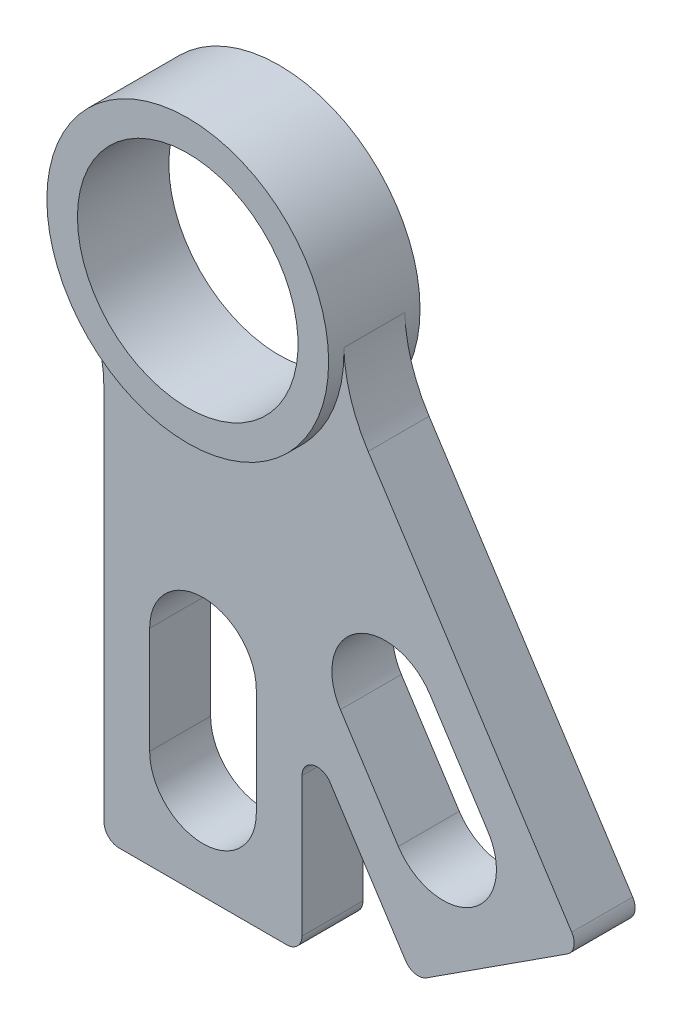
ISO-10303-21;
HEADER;
FILE_DESCRIPTION(('STEP AP214'),'2;1');
FILE_NAME('part.step','',(''),(''),'','','');
FILE_SCHEMA(('AUTOMOTIVE_DESIGN { 1 0 10303 214 1 1 1 1 }'));
ENDSEC;
DATA;
#1=APPLICATION_CONTEXT('core data for automotive mechanical design processes');
#2=APPLICATION_PROTOCOL_DEFINITION('international standard','automotive_design',2000,#1);
#3=PRODUCT_CONTEXT('',#1,'mechanical');
#4=PRODUCT('Part','Part','',(#3));
#5=PRODUCT_RELATED_PRODUCT_CATEGORY('part','',(#4));
#6=PRODUCT_DEFINITION_FORMATION('','',#4);
#7=PRODUCT_DEFINITION_CONTEXT('part definition',#1,'design');
#8=PRODUCT_DEFINITION('design','',#6,#7);
#9=PRODUCT_DEFINITION_SHAPE('','',#8);
#10=(LENGTH_UNIT() NAMED_UNIT(*) SI_UNIT(.MILLI.,.METRE.));
#11=(NAMED_UNIT(*) PLANE_ANGLE_UNIT() SI_UNIT($,.RADIAN.));
#12=(NAMED_UNIT(*) SI_UNIT($,.STERADIAN.) SOLID_ANGLE_UNIT());
#13=UNCERTAINTY_MEASURE_WITH_UNIT(LENGTH_MEASURE(1.E-05),#10,'distance_accuracy_value','');
#14=(GEOMETRIC_REPRESENTATION_CONTEXT(3) GLOBAL_UNCERTAINTY_ASSIGNED_CONTEXT((#13)) GLOBAL_UNIT_ASSIGNED_CONTEXT((#10,
#11,#12)) REPRESENTATION_CONTEXT('',''));
#15=CARTESIAN_POINT('',(0.,0.,0.));
#16=DIRECTION('',(0.,0.,1.));
#17=DIRECTION('',(1.,0.,0.));
#18=AXIS2_PLACEMENT_3D('',#15,#16,#17);
#19=CARTESIAN_POINT('',(0.,0.,4.7625));
#20=DIRECTION('',(0.,0.,-1.));
#21=DIRECTION('',(-1.,0.,0.));
#22=AXIS2_PLACEMENT_3D('',#19,#20,#21);
#23=CYLINDRICAL_SURFACE('',#22,11.495405);
#24=CARTESIAN_POINT('',(0.,0.,4.7625));
#25=DIRECTION('',(0.,0.,1.));
#26=DIRECTION('',(1.,0.,0.));
#27=AXIS2_PLACEMENT_3D('',#24,#25,#26);
#28=CIRCLE('',#27,11.495405);
#29=CARTESIAN_POINT('',(-11.495405,0.,4.7625));
#30=VERTEX_POINT('',#29);
#31=EDGE_CURVE('E384',#30,#30,#28,.T.);
#32=CARTESIAN_POINT('',(0.,0.,-4.7625));
#33=DIRECTION('',(0.,0.,1.));
#34=DIRECTION('',(1.,0.,0.));
#35=AXIS2_PLACEMENT_3D('',#32,#33,#34);
#36=CIRCLE('',#35,11.495405);
#37=CARTESIAN_POINT('',(-11.495405,0.,-4.7625));
#38=VERTEX_POINT('',#37);
#39=EDGE_CURVE('E365',#38,#38,#36,.T.);
#40=CARTESIAN_POINT('',(-11.495405,0.,4.7625));
#41=CARTESIAN_POINT('',(-11.495405,0.,4.66328125));
#42=CARTESIAN_POINT('',(-11.495405,0.,4.5640625));
#43=CARTESIAN_POINT('',(-11.495405,0.,4.365625));
#44=CARTESIAN_POINT('',(-11.495405,0.,4.26640625));
#45=CARTESIAN_POINT('',(-11.495405,0.,4.06796875));
#46=CARTESIAN_POINT('',(-11.495405,0.,3.96875));
#47=CARTESIAN_POINT('',(-11.495405,0.,3.7703125));
#48=CARTESIAN_POINT('',(-11.495405,0.,3.67109375));
#49=CARTESIAN_POINT('',(-11.495405,0.,3.47265625));
#50=CARTESIAN_POINT('',(-11.495405,0.,3.3734375));
#51=CARTESIAN_POINT('',(-11.495405,0.,3.175));
#52=CARTESIAN_POINT('',(-11.495405,0.,3.07578125));
#53=CARTESIAN_POINT('',(-11.495405,0.,2.87734375));
#54=CARTESIAN_POINT('',(-11.495405,0.,2.778125));
#55=CARTESIAN_POINT('',(-11.495405,0.,2.5796875));
#56=CARTESIAN_POINT('',(-11.495405,0.,2.48046875));
#57=CARTESIAN_POINT('',(-11.495405,0.,2.28203125));
#58=CARTESIAN_POINT('',(-11.495405,0.,2.1828125));
#59=CARTESIAN_POINT('',(-11.495405,0.,1.984375));
#60=CARTESIAN_POINT('',(-11.495405,0.,1.88515625));
#61=CARTESIAN_POINT('',(-11.495405,0.,1.68671875));
#62=CARTESIAN_POINT('',(-11.495405,0.,1.5875));
#63=CARTESIAN_POINT('',(-11.495405,0.,1.3890625));
#64=CARTESIAN_POINT('',(-11.495405,0.,1.28984375));
#65=CARTESIAN_POINT('',(-11.495405,0.,1.09140625));
#66=CARTESIAN_POINT('',(-11.495405,0.,0.992187499999999));
#67=CARTESIAN_POINT('',(-11.495405,0.,0.79375));
#68=CARTESIAN_POINT('',(-11.495405,0.,0.69453125));
#69=CARTESIAN_POINT('',(-11.495405,0.,0.49609375));
#70=CARTESIAN_POINT('',(-11.495405,0.,0.396875));
#71=CARTESIAN_POINT('',(-11.495405,0.,0.1984375));
#72=CARTESIAN_POINT('',(-11.495405,0.,0.0992187500000001));
#73=CARTESIAN_POINT('',(-11.495405,0.,-0.0992187500000001));
#74=CARTESIAN_POINT('',(-11.495405,0.,-0.1984375));
#75=CARTESIAN_POINT('',(-11.495405,0.,-0.396875));
#76=CARTESIAN_POINT('',(-11.495405,0.,-0.49609375));
#77=CARTESIAN_POINT('',(-11.495405,0.,-0.69453125));
#78=CARTESIAN_POINT('',(-11.495405,0.,-0.793750000000001));
#79=CARTESIAN_POINT('',(-11.495405,0.,-0.992187500000001));
#80=CARTESIAN_POINT('',(-11.495405,0.,-1.09140625));
#81=CARTESIAN_POINT('',(-11.495405,0.,-1.28984375));
#82=CARTESIAN_POINT('',(-11.495405,0.,-1.3890625));
#83=CARTESIAN_POINT('',(-11.495405,0.,-1.5875));
#84=CARTESIAN_POINT('',(-11.495405,0.,-1.68671875));
#85=CARTESIAN_POINT('',(-11.495405,0.,-1.88515625));
#86=CARTESIAN_POINT('',(-11.495405,0.,-1.984375));
#87=CARTESIAN_POINT('',(-11.495405,0.,-2.1828125));
#88=CARTESIAN_POINT('',(-11.495405,0.,-2.28203125));
#89=CARTESIAN_POINT('',(-11.495405,0.,-2.48046875));
#90=CARTESIAN_POINT('',(-11.495405,0.,-2.5796875));
#91=CARTESIAN_POINT('',(-11.495405,0.,-2.778125));
#92=CARTESIAN_POINT('',(-11.495405,0.,-2.87734375));
#93=CARTESIAN_POINT('',(-11.495405,0.,-3.07578125));
#94=CARTESIAN_POINT('',(-11.495405,0.,-3.175));
#95=CARTESIAN_POINT('',(-11.495405,0.,-3.3734375));
#96=CARTESIAN_POINT('',(-11.495405,0.,-3.47265625));
#97=CARTESIAN_POINT('',(-11.495405,0.,-3.67109375));
#98=CARTESIAN_POINT('',(-11.495405,0.,-3.7703125));
#99=CARTESIAN_POINT('',(-11.495405,0.,-3.96875));
#100=CARTESIAN_POINT('',(-11.495405,0.,-4.06796875));
#101=CARTESIAN_POINT('',(-11.495405,0.,-4.26640625));
#102=CARTESIAN_POINT('',(-11.495405,0.,-4.365625));
#103=CARTESIAN_POINT('',(-11.495405,0.,-4.5640625));
#104=CARTESIAN_POINT('',(-11.495405,0.,-4.66328125));
#105=CARTESIAN_POINT('',(-11.495405,0.,-4.7625));
#106=B_SPLINE_CURVE_WITH_KNOTS('',3,(#40,#41,#42,#43,#44,#45,#46,#47,#48,#49,#50,#51,#52,#53,
#54,#55,#56,#57,#58,#59,#60,#61,#62,#63,#64,#65,#66,#67,#68,#69,#70,#71,#72,#73,#74,#75,#76,#77,
#78,#79,#80,#81,#82,#83,#84,#85,#86,#87,#88,#89,#90,#91,#92,#93,#94,#95,#96,#97,#98,#99,#100,
#101,#102,#103,#104,#105),.UNSPECIFIED.,.F.,.F.,(4,2,2,2,2,2,2,2,2,2,2,2,2,2,2,2,2,2,2,2,2,2,2,
2,2,2,2,2,2,2,2,2,4),(0.,0.29765625,0.5953125,0.892968750000001,1.190625,1.48828125,1.7859375,
2.08359375,2.38125,2.67890625,2.9765625,3.27421875,3.571875,3.86953125,4.1671875,4.46484375,
4.7625,5.06015625,5.3578125,5.65546875,5.953125,6.25078125,6.5484375,6.84609375,7.14375,
7.44140625,7.7390625,8.03671875,8.334375,8.63203125,8.9296875,9.22734375,9.525),.UNSPECIFIED.);
#107=EDGE_CURVE('BSEAM52',#30,#38,#106,.T.);
#108=ORIENTED_EDGE('',*,*,#31,.T.);
#109=ORIENTED_EDGE('',*,*,#39,.F.);
#110=ORIENTED_EDGE('',*,*,#107,.T.);
#111=ORIENTED_EDGE('',*,*,#107,.F.);
#112=EDGE_LOOP('',(#108,#110,#109,#111));
#113=FACE_BOUND('',#112,.T.);
#114=ADVANCED_FACE('F52',(#113),#23,.F.);
#115=CARTESIAN_POINT('',(0.,0.,4.7625));
#116=DIRECTION('',(0.,0.,-1.));
#117=DIRECTION('',(-1.,0.,0.));
#118=AXIS2_PLACEMENT_3D('',#115,#116,#117);
#119=CYLINDRICAL_SURFACE('',#118,14.6812);
#120=DIRECTION('',(0.,0.,-1.));
#121=VECTOR('',#120,1.);
#122=CARTESIAN_POINT('',(-12.585193266832,-7.55979787272684,3.175));
#123=LINE('',#122,#121);
#124=CARTESIAN_POINT('',(-12.585193266832,-7.55979787272667,3.175));
#125=VERTEX_POINT('',#124);
#126=CARTESIAN_POINT('',(-12.585193266832,-7.55979787272684,-3.175));
#127=VERTEX_POINT('',#126);
#128=EDGE_CURVE('E215',#125,#127,#123,.T.);
#129=ORIENTED_EDGE('',*,*,#128,.F.);
#130=CARTESIAN_POINT('',(0.,0.,3.175));
#131=DIRECTION('',(0.,0.,1.));
#132=DIRECTION('',(1.,0.,0.));
#133=AXIS2_PLACEMENT_3D('',#130,#131,#132);
#134=CIRCLE('',#133,14.6812);
#135=CARTESIAN_POINT('',(14.6729838648988,0.491098707398727,3.175));
#136=VERTEX_POINT('',#135);
#137=EDGE_CURVE('E232',#125,#136,#134,.T.);
#138=ORIENTED_EDGE('',*,*,#137,.T.);
#139=DIRECTION('',(0.,0.,-1.));
#140=VECTOR('',#139,1.);
#141=CARTESIAN_POINT('',(14.6729838648992,0.491098707398739,3.175));
#142=LINE('',#141,#140);
#143=CARTESIAN_POINT('',(14.6729838648992,0.491098707398739,-3.175));
#144=VERTEX_POINT('',#143);
#145=EDGE_CURVE('E289',#136,#144,#142,.T.);
#146=ORIENTED_EDGE('',*,*,#145,.T.);
#147=CARTESIAN_POINT('',(0.,0.,-3.175));
#148=DIRECTION('',(0.,0.,1.));
#149=DIRECTION('',(1.,0.,0.));
#150=AXIS2_PLACEMENT_3D('',#147,#148,#149);
#151=CIRCLE('',#150,14.6812);
#152=EDGE_CURVE('E290',#127,#144,#151,.T.);
#153=ORIENTED_EDGE('',*,*,#152,.F.);
#154=EDGE_LOOP('',(#129,#138,#146,#153));
#155=FACE_BOUND('',#154,.T.);
#156=CARTESIAN_POINT('',(0.,0.,4.7625));
#157=DIRECTION('',(0.,0.,1.));
#158=DIRECTION('',(1.,0.,0.));
#159=AXIS2_PLACEMENT_3D('',#156,#157,#158);
#160=CIRCLE('',#159,14.6812);
#161=CARTESIAN_POINT('',(14.6812,0.,4.7625));
#162=VERTEX_POINT('',#161);
#163=EDGE_CURVE('E388',#162,#162,#160,.T.);
#164=ORIENTED_EDGE('',*,*,#163,.F.);
#165=EDGE_LOOP('',(#164));
#166=FACE_BOUND('',#165,.T.);
#167=CARTESIAN_POINT('',(0.,0.,-4.7625));
#168=DIRECTION('',(0.,0.,1.));
#169=DIRECTION('',(1.,0.,0.));
#170=AXIS2_PLACEMENT_3D('',#167,#168,#169);
#171=CIRCLE('',#170,14.6812);
#172=CARTESIAN_POINT('',(14.6812,0.,-4.7625));
#173=VERTEX_POINT('',#172);
#174=EDGE_CURVE('E389',#173,#173,#171,.T.);
#175=ORIENTED_EDGE('',*,*,#174,.T.);
#176=EDGE_LOOP('',(#175));
#177=FACE_BOUND('',#176,.T.);
#178=ADVANCED_FACE('F492',(#155,#166,#177),#119,.T.);
#179=CARTESIAN_POINT('',(0.,0.,4.7625));
#180=DIRECTION('',(0.,0.,1.));
#181=DIRECTION('',(1.,0.,0.));
#182=AXIS2_PLACEMENT_3D('',#179,#180,#181);
#183=PLANE('',#182);
#184=ORIENTED_EDGE('',*,*,#31,.F.);
#185=EDGE_LOOP('',(#184));
#186=FACE_BOUND('',#185,.T.);
#187=ORIENTED_EDGE('',*,*,#163,.T.);
#188=EDGE_LOOP('',(#187));
#189=FACE_BOUND('',#188,.T.);
#190=ADVANCED_FACE('F519',(#186,#189),#183,.T.);
#191=CARTESIAN_POINT('',(0.,0.,-4.7625));
#192=DIRECTION('',(0.,0.,1.));
#193=DIRECTION('',(1.,0.,0.));
#194=AXIS2_PLACEMENT_3D('',#191,#192,#193);
#195=PLANE('',#194);
#196=ORIENTED_EDGE('',*,*,#39,.T.);
#197=EDGE_LOOP('',(#196));
#198=FACE_BOUND('',#197,.T.);
#199=ORIENTED_EDGE('',*,*,#174,.F.);
#200=EDGE_LOOP('',(#199));
#201=FACE_BOUND('',#200,.T.);
#202=ADVANCED_FACE('F523',(#198,#201),#195,.F.);
#203=CARTESIAN_POINT('',(0.,-34.9430697939256,3.175));
#204=DIRECTION('',(0.,0.,-1.));
#205=DIRECTION('',(-1.,0.,0.));
#206=AXIS2_PLACEMENT_3D('',#203,#204,#205);
#207=CYLINDRICAL_SURFACE('',#206,5.55624999999845);
#208=CARTESIAN_POINT('',(0.,-34.9430697939256,-3.175));
#209=DIRECTION('',(0.,0.,1.));
#210=DIRECTION('',(1.,0.,0.));
#211=AXIS2_PLACEMENT_3D('',#208,#209,#210);
#212=CIRCLE('',#211,5.55624999999845);
#213=CARTESIAN_POINT('',(5.55624999999848,-34.9430697939256,-3.175));
#214=VERTEX_POINT('',#213);
#215=CARTESIAN_POINT('',(-5.55624999999842,-34.9430697939256,-3.175));
#216=VERTEX_POINT('',#215);
#217=EDGE_CURVE('E337',#214,#216,#212,.T.);
#218=ORIENTED_EDGE('',*,*,#217,.F.);
#219=DIRECTION('',(0.,0.,-1.));
#220=VECTOR('',#219,1.);
#221=CARTESIAN_POINT('',(5.55624999999848,-34.9430697939256,3.175));
#222=LINE('',#221,#220);
#223=CARTESIAN_POINT('',(5.55624999999848,-34.9430697939256,3.175));
#224=VERTEX_POINT('',#223);
#225=EDGE_CURVE('E362',#224,#214,#222,.T.);
#226=ORIENTED_EDGE('',*,*,#225,.F.);
#227=CARTESIAN_POINT('',(0.,-34.9430697939256,3.175));
#228=DIRECTION('',(0.,0.,1.));
#229=DIRECTION('',(1.,0.,0.));
#230=AXIS2_PLACEMENT_3D('',#227,#228,#229);
#231=CIRCLE('',#230,5.55624999999845);
#232=CARTESIAN_POINT('',(-5.55624999999842,-34.9430697939256,3.175));
#233=VERTEX_POINT('',#232);
#234=EDGE_CURVE('E274',#224,#233,#231,.T.);
#235=ORIENTED_EDGE('',*,*,#234,.T.);
#236=DIRECTION('',(0.,0.,-1.));
#237=VECTOR('',#236,1.);
#238=CARTESIAN_POINT('',(-5.55624999999842,-34.9430697939256,3.175));
#239=LINE('',#238,#237);
#240=EDGE_CURVE('E352',#233,#216,#239,.T.);
#241=ORIENTED_EDGE('',*,*,#240,.T.);
#242=EDGE_LOOP('',(#218,#226,#235,#241));
#243=FACE_BOUND('',#242,.T.);
#244=ADVANCED_FACE('F526',(#243),#207,.F.);
#245=CARTESIAN_POINT('',(5.55624999999848,0.,3.175));
#246=DIRECTION('',(-1.,0.,0.));
#247=DIRECTION('',(0.,0.,1.));
#248=AXIS2_PLACEMENT_3D('',#245,#246,#247);
#249=PLANE('',#248);
#250=DIRECTION('',(0.,1.,0.));
#251=VECTOR('',#250,1.);
#252=CARTESIAN_POINT('',(5.55624999999848,0.,-3.175));
#253=LINE('',#252,#251);
#254=CARTESIAN_POINT('',(5.55624999999848,-46.0555697939288,-3.175));
#255=VERTEX_POINT('',#254);
#256=EDGE_CURVE('E341',#255,#214,#253,.T.);
#257=ORIENTED_EDGE('',*,*,#256,.F.);
#258=DIRECTION('',(0.,0.,-1.));
#259=VECTOR('',#258,1.);
#260=CARTESIAN_POINT('',(5.55624999999848,-46.0555697939288,3.175));
#261=LINE('',#260,#259);
#262=CARTESIAN_POINT('',(5.55624999999848,-46.0555697939288,3.175));
#263=VERTEX_POINT('',#262);
#264=EDGE_CURVE('E359',#263,#255,#261,.T.);
#265=ORIENTED_EDGE('',*,*,#264,.F.);
#266=DIRECTION('',(0.,1.,0.));
#267=VECTOR('',#266,1.);
#268=CARTESIAN_POINT('',(5.55624999999848,0.,3.175));
#269=LINE('',#268,#267);
#270=EDGE_CURVE('E278',#263,#224,#269,.T.);
#271=ORIENTED_EDGE('',*,*,#270,.T.);
#272=ORIENTED_EDGE('',*,*,#225,.T.);
#273=EDGE_LOOP('',(#257,#265,#271,#272));
#274=FACE_BOUND('',#273,.T.);
#275=ADVANCED_FACE('F567',(#274),#249,.T.);
#276=CARTESIAN_POINT('',(0.,-46.0555697939288,3.175));
#277=DIRECTION('',(0.,0.,-1.));
#278=DIRECTION('',(-1.,0.,0.));
#279=AXIS2_PLACEMENT_3D('',#276,#277,#278);
#280=CYLINDRICAL_SURFACE('',#279,5.55624999999845);
#281=CARTESIAN_POINT('',(0.,-46.0555697939288,-3.175));
#282=DIRECTION('',(0.,0.,1.));
#283=DIRECTION('',(1.,0.,0.));
#284=AXIS2_PLACEMENT_3D('',#281,#282,#283);
#285=CIRCLE('',#284,5.55624999999845);
#286=CARTESIAN_POINT('',(-5.55624999999842,-46.0555697939288,-3.175));
#287=VERTEX_POINT('',#286);
#288=EDGE_CURVE('E345',#287,#255,#285,.T.);
#289=ORIENTED_EDGE('',*,*,#288,.F.);
#290=DIRECTION('',(0.,0.,-1.));
#291=VECTOR('',#290,1.);
#292=CARTESIAN_POINT('',(-5.55624999999842,-46.0555697939288,3.175));
#293=LINE('',#292,#291);
#294=CARTESIAN_POINT('',(-5.55624999999842,-46.0555697939288,3.175));
#295=VERTEX_POINT('',#294);
#296=EDGE_CURVE('E355',#295,#287,#293,.T.);
#297=ORIENTED_EDGE('',*,*,#296,.F.);
#298=CARTESIAN_POINT('',(0.,-46.0555697939288,3.175));
#299=DIRECTION('',(0.,0.,1.));
#300=DIRECTION('',(1.,0.,0.));
#301=AXIS2_PLACEMENT_3D('',#298,#299,#300);
#302=CIRCLE('',#301,5.55624999999845);
#303=EDGE_CURVE('E282',#295,#263,#302,.T.);
#304=ORIENTED_EDGE('',*,*,#303,.T.);
#305=ORIENTED_EDGE('',*,*,#264,.T.);
#306=EDGE_LOOP('',(#289,#297,#304,#305));
#307=FACE_BOUND('',#306,.T.);
#308=ADVANCED_FACE('F554',(#307),#280,.F.);
#309=CARTESIAN_POINT('',(18.9851807063152,-29.3356615772006,3.175));
#310=DIRECTION('',(0.,0.,-1.));
#311=DIRECTION('',(-1.,0.,0.));
#312=AXIS2_PLACEMENT_3D('',#309,#310,#311);
#313=CYLINDRICAL_SURFACE('',#312,5.55625000000096);
#314=CARTESIAN_POINT('',(18.9851807063152,-29.3356615772006,-3.175));
#315=DIRECTION('',(0.,0.,1.));
#316=DIRECTION('',(1.,0.,0.));
#317=AXIS2_PLACEMENT_3D('',#314,#315,#316);
#318=CIRCLE('',#317,5.55625000000096);
#319=CARTESIAN_POINT('',(23.649804352708,-26.3168538158465,-3.175));
#320=VERTEX_POINT('',#319);
#321=CARTESIAN_POINT('',(14.3205570599206,-32.354469338556,-3.175));
#322=VERTEX_POINT('',#321);
#323=EDGE_CURVE('E321',#320,#322,#318,.T.);
#324=ORIENTED_EDGE('',*,*,#323,.F.);
#325=DIRECTION('',(0.,0.,-1.));
#326=VECTOR('',#325,1.);
#327=CARTESIAN_POINT('',(23.649804352708,-26.3168538158465,3.175));
#328=LINE('',#327,#326);
#329=CARTESIAN_POINT('',(23.649804352708,-26.3168538158465,3.175));
#330=VERTEX_POINT('',#329);
#331=EDGE_CURVE('E356',#330,#320,#328,.T.);
#332=ORIENTED_EDGE('',*,*,#331,.F.);
#333=CARTESIAN_POINT('',(18.9851807063152,-29.3356615772006,3.175));
#334=DIRECTION('',(0.,0.,1.));
#335=DIRECTION('',(1.,0.,0.));
#336=AXIS2_PLACEMENT_3D('',#333,#334,#335);
#337=CIRCLE('',#336,5.55625000000096);
#338=CARTESIAN_POINT('',(14.3205570599206,-32.354469338556,3.175));
#339=VERTEX_POINT('',#338);
#340=EDGE_CURVE('E259',#330,#339,#337,.T.);
#341=ORIENTED_EDGE('',*,*,#340,.T.);
#342=DIRECTION('',(0.,0.,-1.));
#343=VECTOR('',#342,1.);
#344=CARTESIAN_POINT('',(14.3205570599206,-32.354469338556,3.175));
#345=LINE('',#344,#343);
#346=EDGE_CURVE('E366',#339,#322,#345,.T.);
#347=ORIENTED_EDGE('',*,*,#346,.T.);
#348=EDGE_LOOP('',(#324,#332,#341,#347));
#349=FACE_BOUND('',#348,.T.);
#350=ADVANCED_FACE('F550',(#349),#313,.F.);
#351=CARTESIAN_POINT('',(4.66462364639314,3.01880776135449,3.175));
#352=DIRECTION('',(-0.839527315436279,-0.543317482358478,0.));
#353=DIRECTION('',(0.543317482358478,-0.839527315436279,0.));
#354=AXIS2_PLACEMENT_3D('',#351,#352,#353);
#355=PLANE('',#354);
#356=DIRECTION('',(-0.543317482358478,0.839527315436279,0.));
#357=VECTOR('',#356,1.);
#358=CARTESIAN_POINT('',(4.66462364639314,3.01880776135449,-3.175));
#359=LINE('',#358,#357);
#360=CARTESIAN_POINT('',(29.6874198754185,-35.6461011086351,-3.175));
#361=VERTEX_POINT('',#360);
#362=EDGE_CURVE('E325',#361,#320,#359,.T.);
#363=ORIENTED_EDGE('',*,*,#362,.F.);
#364=DIRECTION('',(0.,0.,-1.));
#365=VECTOR('',#364,1.);
#366=CARTESIAN_POINT('',(29.6874198754185,-35.6461011086351,3.175));
#367=LINE('',#366,#365);
#368=CARTESIAN_POINT('',(29.6874198754185,-35.6461011086351,3.175));
#369=VERTEX_POINT('',#368);
#370=EDGE_CURVE('E372',#369,#361,#367,.T.);
#371=ORIENTED_EDGE('',*,*,#370,.F.);
#372=DIRECTION('',(-0.543317482358478,0.839527315436279,0.));
#373=VECTOR('',#372,1.);
#374=CARTESIAN_POINT('',(4.66462364639314,3.01880776135449,3.175));
#375=LINE('',#374,#373);
#376=EDGE_CURVE('E263',#369,#330,#375,.T.);
#377=ORIENTED_EDGE('',*,*,#376,.T.);
#378=ORIENTED_EDGE('',*,*,#331,.T.);
#379=EDGE_LOOP('',(#363,#371,#377,#378));
#380=FACE_BOUND('',#379,.T.);
#381=ADVANCED_FACE('F553',(#380),#355,.T.);
#382=CARTESIAN_POINT('',(25.0227962290255,-38.6649088699889,3.175));
#383=DIRECTION('',(0.,0.,-1.));
#384=DIRECTION('',(-1.,0.,0.));
#385=AXIS2_PLACEMENT_3D('',#382,#383,#384);
#386=CYLINDRICAL_SURFACE('',#385,5.5562500000004);
#387=CARTESIAN_POINT('',(25.0227962290255,-38.6649088699889,-3.175));
#388=DIRECTION('',(0.,0.,1.));
#389=DIRECTION('',(1.,0.,0.));
#390=AXIS2_PLACEMENT_3D('',#387,#388,#389);
#391=CIRCLE('',#390,5.5562500000004);
#392=CARTESIAN_POINT('',(20.3581725826322,-41.6837166313441,-3.175));
#393=VERTEX_POINT('',#392);
#394=EDGE_CURVE('E329',#393,#361,#391,.T.);
#395=ORIENTED_EDGE('',*,*,#394,.F.);
#396=DIRECTION('',(0.,0.,-1.));
#397=VECTOR('',#396,1.);
#398=CARTESIAN_POINT('',(20.3581725826322,-41.6837166313441,3.175));
#399=LINE('',#398,#397);
#400=CARTESIAN_POINT('',(20.3581725826322,-41.6837166313441,3.175));
#401=VERTEX_POINT('',#400);
#402=EDGE_CURVE('E369',#401,#393,#399,.T.);
#403=ORIENTED_EDGE('',*,*,#402,.F.);
#404=CARTESIAN_POINT('',(25.0227962290255,-38.6649088699889,3.175));
#405=DIRECTION('',(0.,0.,1.));
#406=DIRECTION('',(1.,0.,0.));
#407=AXIS2_PLACEMENT_3D('',#404,#405,#406);
#408=CIRCLE('',#407,5.5562500000004);
#409=EDGE_CURVE('E267',#401,#369,#408,.T.);
#410=ORIENTED_EDGE('',*,*,#409,.T.);
#411=ORIENTED_EDGE('',*,*,#370,.T.);
#412=EDGE_LOOP('',(#395,#403,#410,#411));
#413=FACE_BOUND('',#412,.T.);
#414=ADVANCED_FACE('F533',(#413),#386,.F.);
#415=CARTESIAN_POINT('',(-26.1937499999969,-15.7343197939269,3.175));
#416=DIRECTION('',(0.,0.,-1.));
#417=DIRECTION('',(-1.,0.,0.));
#418=AXIS2_PLACEMENT_3D('',#415,#416,#417);
#419=CYLINDRICAL_SURFACE('',#418,15.8749999999984);
#420=CARTESIAN_POINT('',(-26.1937499999969,-15.7343197939269,-3.175));
#421=DIRECTION('',(0.,0.,1.));
#422=DIRECTION('',(1.,0.,0.));
#423=AXIS2_PLACEMENT_3D('',#420,#421,#422);
#424=CIRCLE('',#423,15.8749999999984);
#425=CARTESIAN_POINT('',(-10.3187499999984,-15.7343197939272,-3.175));
#426=VERTEX_POINT('',#425);
#427=EDGE_CURVE('E210',#426,#127,#424,.T.);
#428=ORIENTED_EDGE('',*,*,#427,.F.);
#429=DIRECTION('',(0.,0.,-1.));
#430=VECTOR('',#429,1.);
#431=CARTESIAN_POINT('',(-10.3187499999984,-15.7343197939272,3.175));
#432=LINE('',#431,#430);
#433=CARTESIAN_POINT('',(-10.3187499999984,-15.7343197939272,3.175));
#434=VERTEX_POINT('',#433);
#435=EDGE_CURVE('E203',#434,#426,#432,.T.);
#436=ORIENTED_EDGE('',*,*,#435,.F.);
#437=CARTESIAN_POINT('',(-26.1937499999969,-15.7343197939269,3.175));
#438=DIRECTION('',(0.,0.,1.));
#439=DIRECTION('',(1.,0.,0.));
#440=AXIS2_PLACEMENT_3D('',#437,#438,#439);
#441=CIRCLE('',#440,15.8749999999984);
#442=EDGE_CURVE('E208',#434,#125,#441,.T.);
#443=ORIENTED_EDGE('',*,*,#442,.T.);
#444=ORIENTED_EDGE('',*,*,#128,.T.);
#445=EDGE_LOOP('',(#428,#436,#443,#444));
#446=FACE_BOUND('',#445,.T.);
#447=ADVANCED_FACE('F205',(#446),#419,.F.);
#448=CARTESIAN_POINT('',(-10.3187499999984,0.,3.175));
#449=DIRECTION('',(1.,0.,0.));
#450=DIRECTION('',(0.,1.,0.));
#451=AXIS2_PLACEMENT_3D('',#448,#449,#450);
#452=PLANE('',#451);
#453=DIRECTION('',(0.,-1.,0.));
#454=VECTOR('',#453,1.);
#455=CARTESIAN_POINT('',(-10.3187499999984,0.,-3.175));
#456=LINE('',#455,#454);
#457=CARTESIAN_POINT('',(-10.3187499999984,-54.7868197939272,-3.175));
#458=VERTEX_POINT('',#457);
#459=EDGE_CURVE('E296',#426,#458,#456,.T.);
#460=ORIENTED_EDGE('',*,*,#459,.T.);
#461=DIRECTION('',(0.,0.,-1.));
#462=VECTOR('',#461,1.);
#463=CARTESIAN_POINT('',(-10.3187499999984,-54.7868197939272,3.175));
#464=LINE('',#463,#462);
#465=CARTESIAN_POINT('',(-10.3187499999984,-54.7868197939272,3.175));
#466=VERTEX_POINT('',#465);
#467=EDGE_CURVE('E222',#458,#466,#464,.F.);
#468=ORIENTED_EDGE('',*,*,#467,.T.);
#469=DIRECTION('',(0.,-1.,0.));
#470=VECTOR('',#469,1.);
#471=CARTESIAN_POINT('',(-10.3187499999984,0.,3.175));
#472=LINE('',#471,#470);
#473=EDGE_CURVE('E219',#434,#466,#472,.T.);
#474=ORIENTED_EDGE('',*,*,#473,.F.);
#475=ORIENTED_EDGE('',*,*,#435,.T.);
#476=EDGE_LOOP('',(#460,#468,#474,#475));
#477=FACE_BOUND('',#476,.T.);
#478=ADVANCED_FACE('F220',(#477),#452,.F.);
#479=CARTESIAN_POINT('',(0.,-56.3743197939272,3.175));
#480=DIRECTION('',(0.,1.,0.));
#481=DIRECTION('',(-1.,0.,0.));
#482=AXIS2_PLACEMENT_3D('',#479,#480,#481);
#483=PLANE('',#482);
#484=DIRECTION('',(1.,0.,0.));
#485=VECTOR('',#484,1.);
#486=CARTESIAN_POINT('',(0.,-56.3743197939272,-3.175));
#487=LINE('',#486,#485);
#488=CARTESIAN_POINT('',(-8.73124999999841,-56.3743197939272,-3.175));
#489=VERTEX_POINT('',#488);
#490=CARTESIAN_POINT('',(8.7312499999983,-56.3743197939272,-3.175));
#491=VERTEX_POINT('',#490);
#492=EDGE_CURVE('E299',#489,#491,#487,.T.);
#493=ORIENTED_EDGE('',*,*,#492,.T.);
#494=DIRECTION('',(0.,0.,-1.));
#495=VECTOR('',#494,1.);
#496=CARTESIAN_POINT('',(8.7312499999983,-56.3743197939272,3.175));
#497=LINE('',#496,#495);
#498=CARTESIAN_POINT('',(8.7312499999983,-56.3743197939272,3.175));
#499=VERTEX_POINT('',#498);
#500=EDGE_CURVE('E422',#491,#499,#497,.F.);
#501=ORIENTED_EDGE('',*,*,#500,.T.);
#502=DIRECTION('',(1.,0.,0.));
#503=VECTOR('',#502,1.);
#504=CARTESIAN_POINT('',(0.,-56.3743197939272,3.175));
#505=LINE('',#504,#503);
#506=CARTESIAN_POINT('',(-8.73124999999841,-56.3743197939272,3.175));
#507=VERTEX_POINT('',#506);
#508=EDGE_CURVE('E225',#507,#499,#505,.T.);
#509=ORIENTED_EDGE('',*,*,#508,.F.);
#510=DIRECTION('',(0.,0.,-1.));
#511=VECTOR('',#510,1.);
#512=CARTESIAN_POINT('',(-8.73124999999841,-56.3743197939272,3.175));
#513=LINE('',#512,#511);
#514=EDGE_CURVE('E418',#507,#489,#513,.T.);
#515=ORIENTED_EDGE('',*,*,#514,.T.);
#516=EDGE_LOOP('',(#493,#501,#509,#515));
#517=FACE_BOUND('',#516,.T.);
#518=ADVANCED_FACE('F501',(#517),#483,.F.);
#519=CARTESIAN_POINT('',(10.318749999996,4.29180784705601E-13,3.175));
#520=DIRECTION('',(1.,0.,0.));
#521=DIRECTION('',(0.,1.,0.));
#522=AXIS2_PLACEMENT_3D('',#519,#520,#521);
#523=PLANE('',#522);
#524=DIRECTION('',(0.,-1.,0.));
#525=VECTOR('',#524,1.);
#526=CARTESIAN_POINT('',(10.318749999996,4.29180784705601E-13,3.175));
#527=LINE('',#526,#525);
#528=CARTESIAN_POINT('',(10.3187499999977,-40.3113700747042,3.175));
#529=VERTEX_POINT('',#528);
#530=CARTESIAN_POINT('',(10.3187499999983,-54.7868197939271,3.175));
#531=VERTEX_POINT('',#530);
#532=EDGE_CURVE('E242',#529,#531,#527,.T.);
#533=ORIENTED_EDGE('',*,*,#532,.T.);
#534=DIRECTION('',(0.,0.,-1.));
#535=VECTOR('',#534,1.);
#536=CARTESIAN_POINT('',(10.3187499999983,-54.7868197939271,-3.175));
#537=LINE('',#536,#535);
#538=CARTESIAN_POINT('',(10.3187499999983,-54.7868197939271,-3.175));
#539=VERTEX_POINT('',#538);
#540=EDGE_CURVE('E402',#531,#539,#537,.T.);
#541=ORIENTED_EDGE('',*,*,#540,.T.);
#542=DIRECTION('',(0.,-1.,0.));
#543=VECTOR('',#542,1.);
#544=CARTESIAN_POINT('',(10.318749999996,4.29180784705601E-13,-3.175));
#545=LINE('',#544,#543);
#546=CARTESIAN_POINT('',(10.3187499999977,-40.3113700747042,-3.175));
#547=VERTEX_POINT('',#546);
#548=EDGE_CURVE('E303',#547,#539,#545,.T.);
#549=ORIENTED_EDGE('',*,*,#548,.F.);
#550=DIRECTION('',(0.,0.,-1.));
#551=VECTOR('',#550,1.);
#552=CARTESIAN_POINT('',(10.3187499999977,-40.3113700747042,3.175));
#553=LINE('',#552,#551);
#554=EDGE_CURVE('E393',#547,#529,#553,.F.);
#555=ORIENTED_EDGE('',*,*,#554,.T.);
#556=EDGE_LOOP('',(#533,#541,#549,#555));
#557=FACE_BOUND('',#556,.T.);
#558=ADVANCED_FACE('F465',(#557),#523,.T.);
#559=CARTESIAN_POINT('',(-8.66287248615638,-5.60635727108545,3.175));
#560=DIRECTION('',(-0.839527315436278,-0.543317482358479,0.));
#561=DIRECTION('',(0.54331748235848,-0.839527315436278,0.));
#562=AXIS2_PLACEMENT_3D('',#559,#560,#561);
#563=PLANE('',#562);
#564=DIRECTION('',(-0.543317482358479,0.839527315436278,0.));
#565=VECTOR('',#564,1.);
#566=CARTESIAN_POINT('',(-8.66287248615638,-5.60635727108545,-3.175));
#567=LINE('',#566,#565);
#568=CARTESIAN_POINT('',(21.1037645107104,-51.6013890139762,-3.175));
#569=VERTEX_POINT('',#568);
#570=CARTESIAN_POINT('',(13.2389996132528,-39.4488535714601,-3.175));
#571=VERTEX_POINT('',#570);
#572=EDGE_CURVE('E307',#569,#571,#567,.T.);
#573=ORIENTED_EDGE('',*,*,#572,.F.);
#574=DIRECTION('',(0.,0.,-1.));
#575=VECTOR('',#574,1.);
#576=CARTESIAN_POINT('',(21.1037645107104,-51.6013890139762,3.175));
#577=LINE('',#576,#575);
#578=CARTESIAN_POINT('',(21.1037645107104,-51.6013890139762,3.175));
#579=VERTEX_POINT('',#578);
#580=EDGE_CURVE('E446',#569,#579,#577,.F.);
#581=ORIENTED_EDGE('',*,*,#580,.T.);
#582=DIRECTION('',(-0.543317482358479,0.839527315436278,0.));
#583=VECTOR('',#582,1.);
#584=CARTESIAN_POINT('',(-8.66287248615638,-5.60635727108545,3.175));
#585=LINE('',#584,#583);
#586=CARTESIAN_POINT('',(13.2389996132528,-39.4488535714601,3.175));
#587=VERTEX_POINT('',#586);
#588=EDGE_CURVE('E246',#579,#587,#585,.T.);
#589=ORIENTED_EDGE('',*,*,#588,.T.);
#590=DIRECTION('',(0.,0.,-1.));
#591=VECTOR('',#590,1.);
#592=CARTESIAN_POINT('',(13.2389996132528,-39.4488535714601,-3.175));
#593=LINE('',#592,#591);
#594=EDGE_CURVE('E442',#587,#571,#593,.T.);
#595=ORIENTED_EDGE('',*,*,#594,.T.);
#596=EDGE_LOOP('',(#573,#581,#589,#595));
#597=FACE_BOUND('',#596,.T.);
#598=ADVANCED_FACE('F473',(#597),#563,.T.);
#599=CARTESIAN_POINT('',(30.6291535001114,-47.3277813561454,3.175));
#600=DIRECTION('',(-0.543317482358489,0.839527315436271,0.));
#601=DIRECTION('',(-0.839527315436271,-0.543317482358489,0.));
#602=AXIS2_PLACEMENT_3D('',#599,#600,#601);
#603=PLANE('',#602);
#604=DIRECTION('',(0.839527315436271,0.543317482358489,0.));
#605=VECTOR('',#604,1.);
#606=CARTESIAN_POINT('',(30.6291535001114,-47.3277813561454,3.175));
#607=LINE('',#606,#605);
#608=CARTESIAN_POINT('',(23.2990306272096,-52.0716221239872,3.175));
#609=VERTEX_POINT('',#608);
#610=CARTESIAN_POINT('',(37.9592763730127,-42.5839405883039,3.175));
#611=VERTEX_POINT('',#610);
#612=EDGE_CURVE('E250',#609,#611,#607,.T.);
#613=ORIENTED_EDGE('',*,*,#612,.F.);
#614=DIRECTION('',(0.,0.,-1.));
#615=VECTOR('',#614,1.);
#616=CARTESIAN_POINT('',(23.2990306272096,-52.0716221239872,-3.175));
#617=LINE('',#616,#615);
#618=CARTESIAN_POINT('',(23.2990306272096,-52.0716221239872,-3.175));
#619=VERTEX_POINT('',#618);
#620=EDGE_CURVE('E438',#609,#619,#617,.T.);
#621=ORIENTED_EDGE('',*,*,#620,.T.);
#622=DIRECTION('',(0.839527315436271,0.543317482358489,0.));
#623=VECTOR('',#622,1.);
#624=CARTESIAN_POINT('',(30.6291535001114,-47.3277813561454,-3.175));
#625=LINE('',#624,#623);
#626=CARTESIAN_POINT('',(37.9592763730127,-42.5839405883039,-3.175));
#627=VERTEX_POINT('',#626);
#628=EDGE_CURVE('E311',#619,#627,#625,.T.);
#629=ORIENTED_EDGE('',*,*,#628,.T.);
#630=DIRECTION('',(0.,0.,-1.));
#631=VECTOR('',#630,1.);
#632=CARTESIAN_POINT('',(37.9592763730127,-42.5839405883039,3.175));
#633=LINE('',#632,#631);
#634=EDGE_CURVE('E76',#627,#611,#633,.F.);
#635=ORIENTED_EDGE('',*,*,#634,.T.);
#636=EDGE_LOOP('',(#613,#621,#629,#635));
#637=FACE_BOUND('',#636,.T.);
#638=ADVANCED_FACE('F478',(#637),#603,.F.);
#639=CARTESIAN_POINT('',(8.66287248615554,5.60635727108527,3.175));
#640=DIRECTION('',(-0.839527315436262,-0.543317482358504,0.));
#641=DIRECTION('',(0.543317482358504,-0.839527315436262,0.));
#642=AXIS2_PLACEMENT_3D('',#639,#640,#641);
#643=PLANE('',#642);
#644=DIRECTION('',(-0.543317482358504,0.839527315436262,0.));
#645=VECTOR('',#644,1.);
#646=CARTESIAN_POINT('',(8.66287248615554,5.60635727108527,3.175));
#647=LINE('',#646,#645);
#648=CARTESIAN_POINT('',(38.4295094830237,-40.3886744718047,3.175));
#649=VERTEX_POINT('',#648);
#650=CARTESIAN_POINT('',(17.2116035032161,-7.60303398572672,3.175));
#651=VERTEX_POINT('',#650);
#652=EDGE_CURVE('E253',#649,#651,#647,.T.);
#653=ORIENTED_EDGE('',*,*,#652,.F.);
#654=DIRECTION('',(0.,0.,-1.));
#655=VECTOR('',#654,1.);
#656=CARTESIAN_POINT('',(38.4295094830237,-40.3886744718047,3.175));
#657=LINE('',#656,#655);
#658=CARTESIAN_POINT('',(38.4295094830237,-40.3886744718047,-3.175));
#659=VERTEX_POINT('',#658);
#660=EDGE_CURVE('E451',#649,#659,#657,.T.);
#661=ORIENTED_EDGE('',*,*,#660,.T.);
#662=DIRECTION('',(-0.543317482358504,0.839527315436262,0.));
#663=VECTOR('',#662,1.);
#664=CARTESIAN_POINT('',(8.66287248615554,5.60635727108527,-3.175));
#665=LINE('',#664,#663);
#666=CARTESIAN_POINT('',(17.2116035032161,-7.60303398572672,-3.175));
#667=VERTEX_POINT('',#666);
#668=EDGE_CURVE('E314',#659,#667,#665,.T.);
#669=ORIENTED_EDGE('',*,*,#668,.T.);
#670=DIRECTION('',(0.,0.,-1.));
#671=VECTOR('',#670,1.);
#672=CARTESIAN_POINT('',(17.2116035032161,-7.60303398572672,3.175));
#673=LINE('',#672,#671);
#674=EDGE_CURVE('E216',#651,#667,#673,.T.);
#675=ORIENTED_EDGE('',*,*,#674,.F.);
#676=EDGE_LOOP('',(#653,#661,#669,#675));
#677=FACE_BOUND('',#676,.T.);
#678=ADVANCED_FACE('F485',(#677),#643,.F.);
#679=CARTESIAN_POINT('',(-4.66462364639679,-3.01880776135752,3.175));
#680=DIRECTION('',(-0.839527315436224,-0.543317482358562,0.));
#681=DIRECTION('',(0.543317482358562,-0.839527315436224,0.));
#682=AXIS2_PLACEMENT_3D('',#679,#680,#681);
#683=PLANE('',#682);
#684=DIRECTION('',(-0.543317482358562,0.839527315436224,0.));
#685=VECTOR('',#684,1.);
#686=CARTESIAN_POINT('',(-4.66462364639679,-3.01880776135752,-3.175));
#687=LINE('',#686,#685);
#688=EDGE_CURVE('E333',#393,#322,#687,.T.);
#689=ORIENTED_EDGE('',*,*,#688,.T.);
#690=ORIENTED_EDGE('',*,*,#346,.F.);
#691=DIRECTION('',(-0.543317482358562,0.839527315436224,0.));
#692=VECTOR('',#691,1.);
#693=CARTESIAN_POINT('',(-4.66462364639679,-3.01880776135752,3.175));
#694=LINE('',#693,#692);
#695=EDGE_CURVE('E271',#401,#339,#694,.T.);
#696=ORIENTED_EDGE('',*,*,#695,.F.);
#697=ORIENTED_EDGE('',*,*,#402,.T.);
#698=EDGE_LOOP('',(#689,#690,#696,#697));
#699=FACE_BOUND('',#698,.T.);
#700=ADVANCED_FACE('F546',(#699),#683,.F.);
#701=CARTESIAN_POINT('',(30.539099635766,1.02213104671393,3.175));
#702=DIRECTION('',(0.,0.,-1.));
#703=DIRECTION('',(-1.,0.,0.));
#704=AXIS2_PLACEMENT_3D('',#701,#702,#703);
#705=CYLINDRICAL_SURFACE('',#704,15.8749999999988);
#706=CARTESIAN_POINT('',(30.539099635766,1.02213104671393,-3.175));
#707=DIRECTION('',(0.,0.,1.));
#708=DIRECTION('',(1.,0.,0.));
#709=AXIS2_PLACEMENT_3D('',#706,#707,#708);
#710=CIRCLE('',#709,15.8749999999988);
#711=EDGE_CURVE('E317',#667,#144,#710,.F.);
#712=ORIENTED_EDGE('',*,*,#711,.T.);
#713=ORIENTED_EDGE('',*,*,#145,.F.);
#714=CARTESIAN_POINT('',(30.539099635766,1.02213104671393,3.175));
#715=DIRECTION('',(0.,0.,1.));
#716=DIRECTION('',(1.,0.,0.));
#717=AXIS2_PLACEMENT_3D('',#714,#715,#716);
#718=CIRCLE('',#717,15.8749999999988);
#719=EDGE_CURVE('E256',#651,#136,#718,.F.);
#720=ORIENTED_EDGE('',*,*,#719,.F.);
#721=ORIENTED_EDGE('',*,*,#674,.T.);
#722=EDGE_LOOP('',(#712,#713,#720,#721));
#723=FACE_BOUND('',#722,.T.);
#724=ADVANCED_FACE('F490',(#723),#705,.F.);
#725=CARTESIAN_POINT('',(-5.55624999999842,0.,3.175));
#726=DIRECTION('',(-1.,0.,0.));
#727=DIRECTION('',(0.,0.,1.));
#728=AXIS2_PLACEMENT_3D('',#725,#726,#727);
#729=PLANE('',#728);
#730=DIRECTION('',(0.,1.,0.));
#731=VECTOR('',#730,1.);
#732=CARTESIAN_POINT('',(-5.55624999999842,0.,-3.175));
#733=LINE('',#732,#731);
#734=EDGE_CURVE('E237',#287,#216,#733,.T.);
#735=ORIENTED_EDGE('',*,*,#734,.T.);
#736=ORIENTED_EDGE('',*,*,#240,.F.);
#737=DIRECTION('',(0.,1.,0.));
#738=VECTOR('',#737,1.);
#739=CARTESIAN_POINT('',(-5.55624999999842,0.,3.175));
#740=LINE('',#739,#738);
#741=EDGE_CURVE('E286',#295,#233,#740,.T.);
#742=ORIENTED_EDGE('',*,*,#741,.F.);
#743=ORIENTED_EDGE('',*,*,#296,.T.);
#744=EDGE_LOOP('',(#735,#736,#742,#743));
#745=FACE_BOUND('',#744,.T.);
#746=ADVANCED_FACE('F549',(#745),#729,.F.);
#747=CARTESIAN_POINT('',(0.,0.,3.175));
#748=DIRECTION('',(0.,0.,1.));
#749=DIRECTION('',(1.,0.,0.));
#750=AXIS2_PLACEMENT_3D('',#747,#748,#749);
#751=PLANE('',#750);
#752=ORIENTED_EDGE('',*,*,#508,.T.);
#753=CARTESIAN_POINT('',(8.7312499999983,-54.7868197939272,3.175));
#754=DIRECTION('',(0.,0.,1.));
#755=DIRECTION('',(1.,0.,0.));
#756=AXIS2_PLACEMENT_3D('',#753,#754,#755);
#757=CIRCLE('',#756,1.5875);
#758=EDGE_CURVE('E433',#499,#531,#757,.T.);
#759=ORIENTED_EDGE('',*,*,#758,.T.);
#760=ORIENTED_EDGE('',*,*,#532,.F.);
#761=CARTESIAN_POINT('',(11.9062499999977,-40.3113700747042,3.175));
#762=DIRECTION('',(0.,0.,1.));
#763=DIRECTION('',(1.,0.,0.));
#764=AXIS2_PLACEMENT_3D('',#761,#762,#763);
#765=CIRCLE('',#764,1.5875);
#766=EDGE_CURVE('E13',#529,#587,#765,.F.);
#767=ORIENTED_EDGE('',*,*,#766,.T.);
#768=ORIENTED_EDGE('',*,*,#588,.F.);
#769=CARTESIAN_POINT('',(22.4365141239655,-50.7388725107321,3.175));
#770=DIRECTION('',(0.,0.,1.));
#771=DIRECTION('',(1.,0.,0.));
#772=AXIS2_PLACEMENT_3D('',#769,#770,#771);
#773=CIRCLE('',#772,1.5875);
#774=EDGE_CURVE('E430',#579,#609,#773,.T.);
#775=ORIENTED_EDGE('',*,*,#774,.T.);
#776=ORIENTED_EDGE('',*,*,#612,.T.);
#777=CARTESIAN_POINT('',(37.0967598697686,-41.2511909750488,3.175));
#778=DIRECTION('',(0.,0.,1.));
#779=DIRECTION('',(1.,0.,0.));
#780=AXIS2_PLACEMENT_3D('',#777,#778,#779);
#781=CIRCLE('',#780,1.5875);
#782=EDGE_CURVE('E68',#611,#649,#781,.T.);
#783=ORIENTED_EDGE('',*,*,#782,.T.);
#784=ORIENTED_EDGE('',*,*,#652,.T.);
#785=ORIENTED_EDGE('',*,*,#719,.T.);
#786=ORIENTED_EDGE('',*,*,#137,.F.);
#787=ORIENTED_EDGE('',*,*,#442,.F.);
#788=ORIENTED_EDGE('',*,*,#473,.T.);
#789=CARTESIAN_POINT('',(-8.73124999999841,-54.7868197939272,3.175));
#790=DIRECTION('',(0.,0.,1.));
#791=DIRECTION('',(1.,0.,0.));
#792=AXIS2_PLACEMENT_3D('',#789,#790,#791);
#793=CIRCLE('',#792,1.5875);
#794=EDGE_CURVE('E427',#466,#507,#793,.T.);
#795=ORIENTED_EDGE('',*,*,#794,.T.);
#796=EDGE_LOOP('',(#752,#759,#760,#767,#768,#775,#776,#783,#784,#785,#786,#787,#788,#795));
#797=FACE_BOUND('',#796,.T.);
#798=ORIENTED_EDGE('',*,*,#340,.F.);
#799=ORIENTED_EDGE('',*,*,#376,.F.);
#800=ORIENTED_EDGE('',*,*,#409,.F.);
#801=ORIENTED_EDGE('',*,*,#695,.T.);
#802=EDGE_LOOP('',(#798,#799,#800,#801));
#803=FACE_BOUND('',#802,.T.);
#804=ORIENTED_EDGE('',*,*,#234,.F.);
#805=ORIENTED_EDGE('',*,*,#270,.F.);
#806=ORIENTED_EDGE('',*,*,#303,.F.);
#807=ORIENTED_EDGE('',*,*,#741,.T.);
#808=EDGE_LOOP('',(#804,#805,#806,#807));
#809=FACE_BOUND('',#808,.T.);
#810=ADVANCED_FACE('F229',(#797,#803,#809),#751,.T.);
#811=CARTESIAN_POINT('',(0.,0.,-3.175));
#812=DIRECTION('',(0.,0.,1.));
#813=DIRECTION('',(1.,0.,0.));
#814=AXIS2_PLACEMENT_3D('',#811,#812,#813);
#815=PLANE('',#814);
#816=ORIENTED_EDGE('',*,*,#548,.T.);
#817=CARTESIAN_POINT('',(8.7312499999983,-54.7868197939272,-3.175));
#818=DIRECTION('',(0.,0.,1.));
#819=DIRECTION('',(1.,0.,0.));
#820=AXIS2_PLACEMENT_3D('',#817,#818,#819);
#821=CIRCLE('',#820,1.5875);
#822=EDGE_CURVE('E415',#539,#491,#821,.F.);
#823=ORIENTED_EDGE('',*,*,#822,.T.);
#824=ORIENTED_EDGE('',*,*,#492,.F.);
#825=CARTESIAN_POINT('',(-8.73124999999841,-54.7868197939272,-3.175));
#826=DIRECTION('',(0.,0.,1.));
#827=DIRECTION('',(1.,0.,0.));
#828=AXIS2_PLACEMENT_3D('',#825,#826,#827);
#829=CIRCLE('',#828,1.5875);
#830=EDGE_CURVE('E409',#489,#458,#829,.F.);
#831=ORIENTED_EDGE('',*,*,#830,.T.);
#832=ORIENTED_EDGE('',*,*,#459,.F.);
#833=ORIENTED_EDGE('',*,*,#427,.T.);
#834=ORIENTED_EDGE('',*,*,#152,.T.);
#835=ORIENTED_EDGE('',*,*,#711,.F.);
#836=ORIENTED_EDGE('',*,*,#668,.F.);
#837=CARTESIAN_POINT('',(37.0967598697686,-41.2511909750488,-3.175));
#838=DIRECTION('',(0.,0.,1.));
#839=DIRECTION('',(1.,0.,0.));
#840=AXIS2_PLACEMENT_3D('',#837,#838,#839);
#841=CIRCLE('',#840,1.5875);
#842=EDGE_CURVE('E406',#659,#627,#841,.F.);
#843=ORIENTED_EDGE('',*,*,#842,.T.);
#844=ORIENTED_EDGE('',*,*,#628,.F.);
#845=CARTESIAN_POINT('',(22.4365141239655,-50.7388725107321,-3.175));
#846=DIRECTION('',(0.,0.,1.));
#847=DIRECTION('',(1.,0.,0.));
#848=AXIS2_PLACEMENT_3D('',#845,#846,#847);
#849=CIRCLE('',#848,1.5875);
#850=EDGE_CURVE('E412',#619,#569,#849,.F.);
#851=ORIENTED_EDGE('',*,*,#850,.T.);
#852=ORIENTED_EDGE('',*,*,#572,.T.);
#853=CARTESIAN_POINT('',(11.9062499999977,-40.3113700747042,-3.175));
#854=DIRECTION('',(0.,0.,1.));
#855=DIRECTION('',(1.,0.,0.));
#856=AXIS2_PLACEMENT_3D('',#853,#854,#855);
#857=CIRCLE('',#856,1.5875);
#858=EDGE_CURVE('E61',#571,#547,#857,.T.);
#859=ORIENTED_EDGE('',*,*,#858,.T.);
#860=EDGE_LOOP('',(#816,#823,#824,#831,#832,#833,#834,#835,#836,#843,#844,#851,#852,#859));
#861=FACE_BOUND('',#860,.T.);
#862=ORIENTED_EDGE('',*,*,#323,.T.);
#863=ORIENTED_EDGE('',*,*,#688,.F.);
#864=ORIENTED_EDGE('',*,*,#394,.T.);
#865=ORIENTED_EDGE('',*,*,#362,.T.);
#866=EDGE_LOOP('',(#862,#863,#864,#865));
#867=FACE_BOUND('',#866,.T.);
#868=ORIENTED_EDGE('',*,*,#217,.T.);
#869=ORIENTED_EDGE('',*,*,#734,.F.);
#870=ORIENTED_EDGE('',*,*,#288,.T.);
#871=ORIENTED_EDGE('',*,*,#256,.T.);
#872=EDGE_LOOP('',(#868,#869,#870,#871));
#873=FACE_BOUND('',#872,.T.);
#874=ADVANCED_FACE('F458',(#861,#867,#873),#815,.F.);
#875=CARTESIAN_POINT('',(8.7312499999983,-54.7868197939272,3.175));
#876=DIRECTION('',(0.,0.,1.));
#877=DIRECTION('',(1.,0.,0.));
#878=AXIS2_PLACEMENT_3D('',#875,#876,#877);
#879=CYLINDRICAL_SURFACE('',#878,1.5875);
#880=ORIENTED_EDGE('',*,*,#758,.F.);
#881=ORIENTED_EDGE('',*,*,#500,.F.);
#882=ORIENTED_EDGE('',*,*,#822,.F.);
#883=ORIENTED_EDGE('',*,*,#540,.F.);
#884=EDGE_LOOP('',(#880,#881,#882,#883));
#885=FACE_BOUND('',#884,.T.);
#886=ADVANCED_FACE('F504',(#885),#879,.T.);
#887=CARTESIAN_POINT('',(22.4365141239655,-50.7388725107321,3.175));
#888=DIRECTION('',(0.,0.,1.));
#889=DIRECTION('',(1.,0.,0.));
#890=AXIS2_PLACEMENT_3D('',#887,#888,#889);
#891=CYLINDRICAL_SURFACE('',#890,1.5875);
#892=ORIENTED_EDGE('',*,*,#774,.F.);
#893=ORIENTED_EDGE('',*,*,#580,.F.);
#894=ORIENTED_EDGE('',*,*,#850,.F.);
#895=ORIENTED_EDGE('',*,*,#620,.F.);
#896=EDGE_LOOP('',(#892,#893,#894,#895));
#897=FACE_BOUND('',#896,.T.);
#898=ADVANCED_FACE('F476',(#897),#891,.T.);
#899=CARTESIAN_POINT('',(11.9062499999977,-40.3113700747042,3.175));
#900=DIRECTION('',(0.,0.,1.));
#901=DIRECTION('',(1.,0.,0.));
#902=AXIS2_PLACEMENT_3D('',#899,#900,#901);
#903=CYLINDRICAL_SURFACE('',#902,1.5875);
#904=ORIENTED_EDGE('',*,*,#766,.F.);
#905=ORIENTED_EDGE('',*,*,#554,.F.);
#906=ORIENTED_EDGE('',*,*,#858,.F.);
#907=ORIENTED_EDGE('',*,*,#594,.F.);
#908=EDGE_LOOP('',(#904,#905,#906,#907));
#909=FACE_BOUND('',#908,.T.);
#910=ADVANCED_FACE('F469',(#909),#903,.F.);
#911=CARTESIAN_POINT('',(-8.73124999999841,-54.7868197939272,3.175));
#912=DIRECTION('',(0.,0.,-1.));
#913=DIRECTION('',(-1.,0.,0.));
#914=AXIS2_PLACEMENT_3D('',#911,#912,#913);
#915=CYLINDRICAL_SURFACE('',#914,1.5875);
#916=ORIENTED_EDGE('',*,*,#794,.F.);
#917=ORIENTED_EDGE('',*,*,#467,.F.);
#918=ORIENTED_EDGE('',*,*,#830,.F.);
#919=ORIENTED_EDGE('',*,*,#514,.F.);
#920=EDGE_LOOP('',(#916,#917,#918,#919));
#921=FACE_BOUND('',#920,.T.);
#922=ADVANCED_FACE('F496',(#921),#915,.T.);
#923=CARTESIAN_POINT('',(37.0967598697686,-41.2511909750488,3.175));
#924=DIRECTION('',(0.,0.,-1.));
#925=DIRECTION('',(-1.,0.,0.));
#926=AXIS2_PLACEMENT_3D('',#923,#924,#925);
#927=CYLINDRICAL_SURFACE('',#926,1.5875);
#928=ORIENTED_EDGE('',*,*,#782,.F.);
#929=ORIENTED_EDGE('',*,*,#634,.F.);
#930=ORIENTED_EDGE('',*,*,#842,.F.);
#931=ORIENTED_EDGE('',*,*,#660,.F.);
#932=EDGE_LOOP('',(#928,#929,#930,#931));
#933=FACE_BOUND('',#932,.T.);
#934=ADVANCED_FACE('F54',(#933),#927,.T.);
#935=CLOSED_SHELL('',(#114,#178,#190,#202,#244,#275,#308,#350,#381,#414,#447,#478,#518,#558,
#598,#638,#678,#700,#724,#746,#810,#874,#886,#898,#910,#922,#934));
#936=MANIFOLD_SOLID_BREP('B2',#935);
#937=ADVANCED_BREP_SHAPE_REPRESENTATION('',(#18,#936),#14);
#938=SHAPE_DEFINITION_REPRESENTATION(#9,#937);
ENDSEC;
END-ISO-10303-21;
